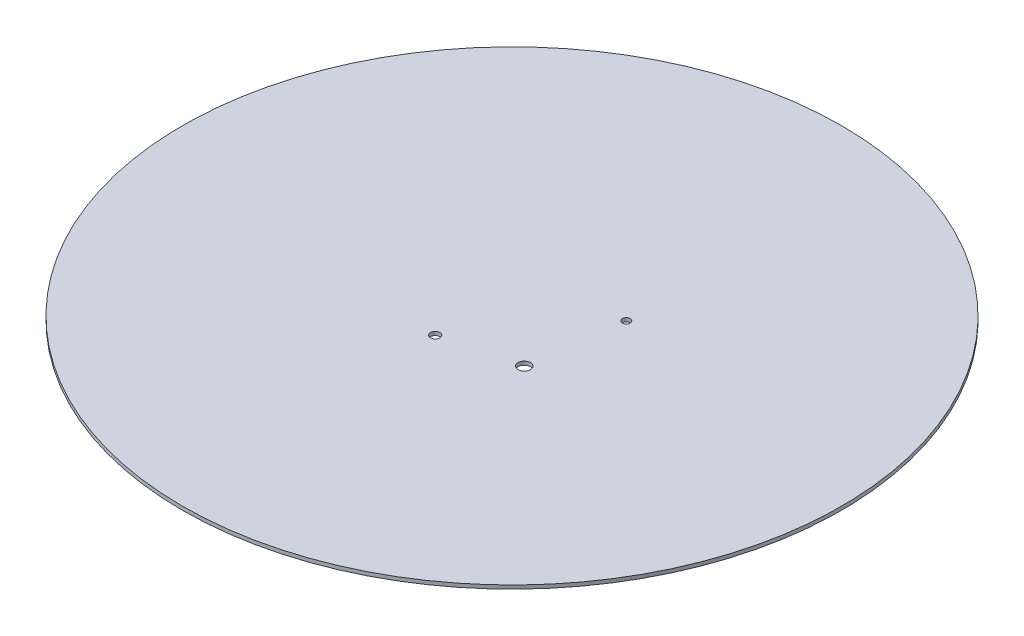
ISO-10303-21;
HEADER;
FILE_DESCRIPTION(('STEP AP214'),'2;1');
FILE_NAME('part.step','',(''),(''),'','','');
FILE_SCHEMA(('AUTOMOTIVE_DESIGN { 1 0 10303 214 1 1 1 1 }'));
ENDSEC;
DATA;
#1=APPLICATION_CONTEXT('core data for automotive mechanical design processes');
#2=APPLICATION_PROTOCOL_DEFINITION('international standard','automotive_design',2000,#1);
#3=PRODUCT_CONTEXT('',#1,'mechanical');
#4=PRODUCT('Part','Part','',(#3));
#5=PRODUCT_RELATED_PRODUCT_CATEGORY('part','',(#4));
#6=PRODUCT_DEFINITION_FORMATION('','',#4);
#7=PRODUCT_DEFINITION_CONTEXT('part definition',#1,'design');
#8=PRODUCT_DEFINITION('design','',#6,#7);
#9=PRODUCT_DEFINITION_SHAPE('','',#8);
#10=(LENGTH_UNIT() NAMED_UNIT(*) SI_UNIT(.MILLI.,.METRE.));
#11=(NAMED_UNIT(*) PLANE_ANGLE_UNIT() SI_UNIT($,.RADIAN.));
#12=(NAMED_UNIT(*) SI_UNIT($,.STERADIAN.) SOLID_ANGLE_UNIT());
#13=UNCERTAINTY_MEASURE_WITH_UNIT(LENGTH_MEASURE(1.E-05),#10,'distance_accuracy_value','');
#14=(GEOMETRIC_REPRESENTATION_CONTEXT(3) GLOBAL_UNCERTAINTY_ASSIGNED_CONTEXT((#13)) GLOBAL_UNIT_ASSIGNED_CONTEXT((#10,
#11,#12)) REPRESENTATION_CONTEXT('',''));
#15=CARTESIAN_POINT('',(0.,0.,0.));
#16=DIRECTION('',(0.,0.,1.));
#17=DIRECTION('',(1.,0.,0.));
#18=AXIS2_PLACEMENT_3D('',#15,#16,#17);
#19=CARTESIAN_POINT('',(0.,3.,0.));
#20=DIRECTION('',(0.,1.,0.));
#21=DIRECTION('',(0.,0.,1.));
#22=AXIS2_PLACEMENT_3D('',#19,#20,#21);
#23=PLANE('',#22);
#24=CARTESIAN_POINT('',(41.1365269254702,3.,30.9578768992083));
#25=DIRECTION('',(0.,1.,0.));
#26=DIRECTION('',(0.,0.,1.));
#27=AXIS2_PLACEMENT_3D('',#24,#25,#26);
#28=CIRCLE('',#27,5.11748924452604);
#29=CARTESIAN_POINT('',(41.1365269254702,3.,36.0753661437343));
#30=VERTEX_POINT('',#29);
#31=EDGE_CURVE('E53',#30,#30,#28,.T.);
#32=ORIENTED_EDGE('',*,*,#31,.F.);
#33=EDGE_LOOP('',(#32));
#34=FACE_BOUND('',#33,.T.);
#35=CARTESIAN_POINT('',(0.,3.,0.));
#36=DIRECTION('',(0.,1.,0.));
#37=DIRECTION('',(0.,0.,1.));
#38=AXIS2_PLACEMENT_3D('',#35,#36,#37);
#39=CIRCLE('',#38,273.347390039478);
#40=CARTESIAN_POINT('',(0.,3.,273.347390039478));
#41=VERTEX_POINT('',#40);
#42=EDGE_CURVE('E10',#41,#41,#39,.T.);
#43=ORIENTED_EDGE('',*,*,#42,.T.);
#44=EDGE_LOOP('',(#43));
#45=FACE_BOUND('',#44,.T.);
#46=CARTESIAN_POINT('',(-17.9886521103185,3.,45.6841337486367));
#47=DIRECTION('',(0.,1.,0.));
#48=DIRECTION('',(0.,0.,1.));
#49=AXIS2_PLACEMENT_3D('',#46,#47,#48);
#50=CIRCLE('',#49,3.86005621658114);
#51=CARTESIAN_POINT('',(-17.9886521103185,3.,49.5441899652178));
#52=VERTEX_POINT('',#51);
#53=EDGE_CURVE('E48',#52,#52,#50,.T.);
#54=ORIENTED_EDGE('',*,*,#53,.F.);
#55=EDGE_LOOP('',(#54));
#56=FACE_BOUND('',#55,.T.);
#57=CARTESIAN_POINT('',(50.9121592395445,3.,-43.8952976981));
#58=DIRECTION('',(0.,1.,0.));
#59=DIRECTION('',(0.,0.,1.));
#60=AXIS2_PLACEMENT_3D('',#57,#58,#59);
#61=CIRCLE('',#60,3.21787908812008);
#62=CARTESIAN_POINT('',(50.9121592395445,3.,-40.6774186099799));
#63=VERTEX_POINT('',#62);
#64=EDGE_CURVE('E60',#63,#63,#61,.T.);
#65=ORIENTED_EDGE('',*,*,#64,.F.);
#66=EDGE_LOOP('',(#65));
#67=FACE_BOUND('',#66,.T.);
#68=ADVANCED_FACE('F35',(#34,#45,#56,#67),#23,.T.);
#69=CARTESIAN_POINT('',(0.,0.,0.));
#70=DIRECTION('',(0.,1.,0.));
#71=DIRECTION('',(0.,0.,1.));
#72=AXIS2_PLACEMENT_3D('',#69,#70,#71);
#73=PLANE('',#72);
#74=CARTESIAN_POINT('',(0.,0.,0.));
#75=DIRECTION('',(0.,1.,0.));
#76=DIRECTION('',(0.,0.,1.));
#77=AXIS2_PLACEMENT_3D('',#74,#75,#76);
#78=CIRCLE('',#77,273.347390039478);
#79=CARTESIAN_POINT('',(0.,0.,273.347390039478));
#80=VERTEX_POINT('',#79);
#81=EDGE_CURVE('E39',#80,#80,#78,.T.);
#82=ORIENTED_EDGE('',*,*,#81,.F.);
#83=EDGE_LOOP('',(#82));
#84=FACE_BOUND('',#83,.T.);
#85=CARTESIAN_POINT('',(-17.9886521103185,0.,45.6841337486367));
#86=DIRECTION('',(0.,1.,0.));
#87=DIRECTION('',(0.,0.,1.));
#88=AXIS2_PLACEMENT_3D('',#85,#86,#87);
#89=CIRCLE('',#88,3.86005621658114);
#90=CARTESIAN_POINT('',(-17.9886521103185,0.,49.5441899652178));
#91=VERTEX_POINT('',#90);
#92=EDGE_CURVE('E50',#91,#91,#89,.T.);
#93=ORIENTED_EDGE('',*,*,#92,.T.);
#94=EDGE_LOOP('',(#93));
#95=FACE_BOUND('',#94,.T.);
#96=CARTESIAN_POINT('',(41.1365269254702,0.,30.9578768992083));
#97=DIRECTION('',(0.,1.,0.));
#98=DIRECTION('',(0.,0.,1.));
#99=AXIS2_PLACEMENT_3D('',#96,#97,#98);
#100=CIRCLE('',#99,5.11748924452604);
#101=CARTESIAN_POINT('',(41.1365269254702,0.,36.0753661437343));
#102=VERTEX_POINT('',#101);
#103=EDGE_CURVE('E56',#102,#102,#100,.T.);
#104=ORIENTED_EDGE('',*,*,#103,.T.);
#105=EDGE_LOOP('',(#104));
#106=FACE_BOUND('',#105,.T.);
#107=CARTESIAN_POINT('',(50.9121592395445,0.,-43.8952976981));
#108=DIRECTION('',(0.,1.,0.));
#109=DIRECTION('',(0.,0.,1.));
#110=AXIS2_PLACEMENT_3D('',#107,#108,#109);
#111=CIRCLE('',#110,3.21787908812008);
#112=CARTESIAN_POINT('',(50.9121592395445,0.,-40.6774186099799));
#113=VERTEX_POINT('',#112);
#114=EDGE_CURVE('E64',#113,#113,#111,.T.);
#115=ORIENTED_EDGE('',*,*,#114,.T.);
#116=EDGE_LOOP('',(#115));
#117=FACE_BOUND('',#116,.T.);
#118=ADVANCED_FACE('F74',(#84,#95,#106,#117),#73,.F.);
#119=CARTESIAN_POINT('',(0.,3.,0.));
#120=DIRECTION('',(0.,-1.,0.));
#121=DIRECTION('',(0.,0.,-1.));
#122=AXIS2_PLACEMENT_3D('',#119,#120,#121);
#123=CYLINDRICAL_SURFACE('',#122,273.347390039478);
#124=ORIENTED_EDGE('',*,*,#42,.F.);
#125=EDGE_LOOP('',(#124));
#126=FACE_BOUND('',#125,.T.);
#127=ORIENTED_EDGE('',*,*,#81,.T.);
#128=EDGE_LOOP('',(#127));
#129=FACE_BOUND('',#128,.T.);
#130=ADVANCED_FACE('F37',(#126,#129),#123,.T.);
#131=CARTESIAN_POINT('',(-17.9886521103185,3.,45.6841337486367));
#132=DIRECTION('',(0.,-1.,0.));
#133=DIRECTION('',(0.,0.,-1.));
#134=AXIS2_PLACEMENT_3D('',#131,#132,#133);
#135=CYLINDRICAL_SURFACE('',#134,3.86005621658114);
#136=ORIENTED_EDGE('',*,*,#53,.T.);
#137=EDGE_LOOP('',(#136));
#138=FACE_BOUND('',#137,.T.);
#139=ORIENTED_EDGE('',*,*,#92,.F.);
#140=EDGE_LOOP('',(#139));
#141=FACE_BOUND('',#140,.T.);
#142=ADVANCED_FACE('F83',(#138,#141),#135,.F.);
#143=CARTESIAN_POINT('',(41.1365269254702,3.,30.9578768992083));
#144=DIRECTION('',(0.,-1.,0.));
#145=DIRECTION('',(0.,0.,-1.));
#146=AXIS2_PLACEMENT_3D('',#143,#144,#145);
#147=CYLINDRICAL_SURFACE('',#146,5.11748924452604);
#148=ORIENTED_EDGE('',*,*,#31,.T.);
#149=EDGE_LOOP('',(#148));
#150=FACE_BOUND('',#149,.T.);
#151=ORIENTED_EDGE('',*,*,#103,.F.);
#152=EDGE_LOOP('',(#151));
#153=FACE_BOUND('',#152,.T.);
#154=ADVANCED_FACE('F86',(#150,#153),#147,.F.);
#155=CARTESIAN_POINT('',(50.9121592395445,3.,-43.8952976981));
#156=DIRECTION('',(0.,-1.,0.));
#157=DIRECTION('',(0.,0.,-1.));
#158=AXIS2_PLACEMENT_3D('',#155,#156,#157);
#159=CYLINDRICAL_SURFACE('',#158,3.21787908812008);
#160=ORIENTED_EDGE('',*,*,#64,.T.);
#161=EDGE_LOOP('',(#160));
#162=FACE_BOUND('',#161,.T.);
#163=ORIENTED_EDGE('',*,*,#114,.F.);
#164=EDGE_LOOP('',(#163));
#165=FACE_BOUND('',#164,.T.);
#166=ADVANCED_FACE('F70',(#162,#165),#159,.F.);
#167=CLOSED_SHELL('',(#68,#118,#130,#142,#154,#166));
#168=MANIFOLD_SOLID_BREP('B2',#167);
#169=ADVANCED_BREP_SHAPE_REPRESENTATION('',(#18,#168),#14);
#170=SHAPE_DEFINITION_REPRESENTATION(#9,#169);
ENDSEC;
END-ISO-10303-21;
